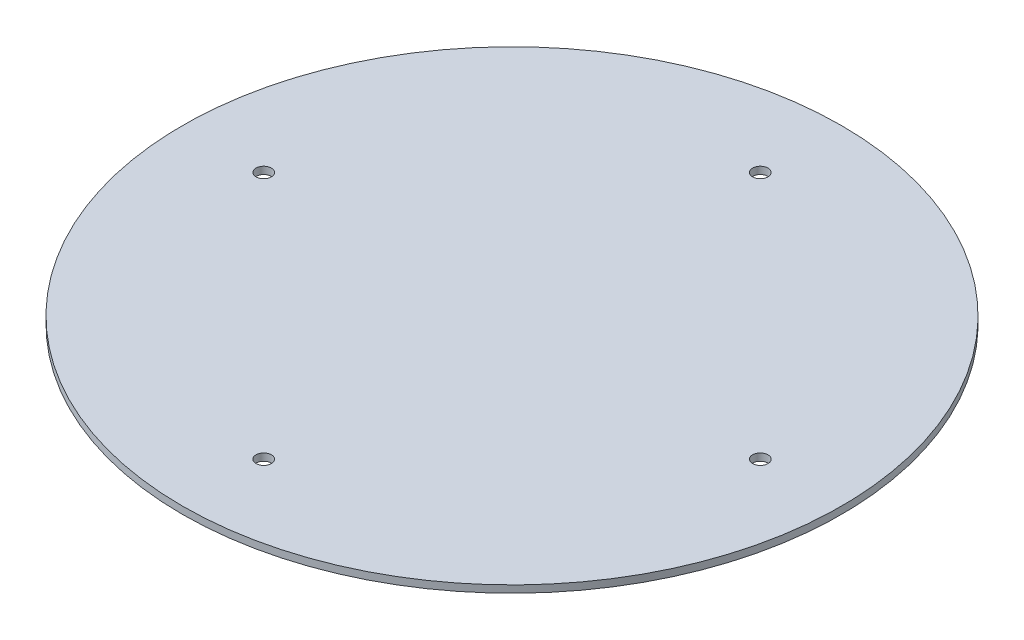
ISO-10303-21;
HEADER;
FILE_DESCRIPTION(('STEP AP214'),'2;1');
FILE_NAME('part.step','',(''),(''),'','','');
FILE_SCHEMA(('AUTOMOTIVE_DESIGN { 1 0 10303 214 1 1 1 1 }'));
ENDSEC;
DATA;
#1=APPLICATION_CONTEXT('core data for automotive mechanical design processes');
#2=APPLICATION_PROTOCOL_DEFINITION('international standard','automotive_design',2000,#1);
#3=PRODUCT_CONTEXT('',#1,'mechanical');
#4=PRODUCT('Part','Part','',(#3));
#5=PRODUCT_RELATED_PRODUCT_CATEGORY('part','',(#4));
#6=PRODUCT_DEFINITION_FORMATION('','',#4);
#7=PRODUCT_DEFINITION_CONTEXT('part definition',#1,'design');
#8=PRODUCT_DEFINITION('design','',#6,#7);
#9=PRODUCT_DEFINITION_SHAPE('','',#8);
#10=(LENGTH_UNIT() NAMED_UNIT(*) SI_UNIT(.MILLI.,.METRE.));
#11=(NAMED_UNIT(*) PLANE_ANGLE_UNIT() SI_UNIT($,.RADIAN.));
#12=(NAMED_UNIT(*) SI_UNIT($,.STERADIAN.) SOLID_ANGLE_UNIT());
#13=UNCERTAINTY_MEASURE_WITH_UNIT(LENGTH_MEASURE(1.E-05),#10,'distance_accuracy_value','');
#14=(GEOMETRIC_REPRESENTATION_CONTEXT(3) GLOBAL_UNCERTAINTY_ASSIGNED_CONTEXT((#13)) GLOBAL_UNIT_ASSIGNED_CONTEXT((#10,
#11,#12)) REPRESENTATION_CONTEXT('',''));
#15=CARTESIAN_POINT('',(0.,0.,0.));
#16=DIRECTION('',(0.,0.,1.));
#17=DIRECTION('',(1.,0.,0.));
#18=AXIS2_PLACEMENT_3D('',#15,#16,#17);
#19=CARTESIAN_POINT('',(0.,1.6,0.));
#20=DIRECTION('',(0.,-1.,0.));
#21=DIRECTION('',(0.,0.,-1.));
#22=AXIS2_PLACEMENT_3D('',#19,#20,#21);
#23=CYLINDRICAL_SURFACE('',#22,73.);
#24=CARTESIAN_POINT('',(0.,1.6,0.));
#25=DIRECTION('',(0.,1.,0.));
#26=DIRECTION('',(0.,0.,1.));
#27=AXIS2_PLACEMENT_3D('',#24,#25,#26);
#28=CIRCLE('',#27,73.);
#29=CARTESIAN_POINT('',(0.,1.6,73.));
#30=VERTEX_POINT('',#29);
#31=EDGE_CURVE('E11',#30,#30,#28,.T.);
#32=ORIENTED_EDGE('',*,*,#31,.F.);
#33=EDGE_LOOP('',(#32));
#34=FACE_BOUND('',#33,.T.);
#35=CARTESIAN_POINT('',(0.,0.,0.));
#36=DIRECTION('',(0.,1.,0.));
#37=DIRECTION('',(0.,0.,1.));
#38=AXIS2_PLACEMENT_3D('',#35,#36,#37);
#39=CIRCLE('',#38,73.);
#40=CARTESIAN_POINT('',(0.,0.,73.));
#41=VERTEX_POINT('',#40);
#42=EDGE_CURVE('E47',#41,#41,#39,.T.);
#43=ORIENTED_EDGE('',*,*,#42,.T.);
#44=EDGE_LOOP('',(#43));
#45=FACE_BOUND('',#44,.T.);
#46=ADVANCED_FACE('F44',(#34,#45),#23,.T.);
#47=CARTESIAN_POINT('',(0.,1.6,0.));
#48=DIRECTION('',(0.,1.,0.));
#49=DIRECTION('',(0.,0.,1.));
#50=AXIS2_PLACEMENT_3D('',#47,#48,#49);
#51=PLANE('',#50);
#52=CARTESIAN_POINT('',(0.,1.6,-55.));
#53=DIRECTION('',(0.,1.,0.));
#54=DIRECTION('',(0.,0.,1.));
#55=AXIS2_PLACEMENT_3D('',#52,#53,#54);
#56=CIRCLE('',#55,1.7);
#57=CARTESIAN_POINT('',(0.,1.6,-53.3));
#58=VERTEX_POINT('',#57);
#59=EDGE_CURVE('E85',#58,#58,#56,.T.);
#60=ORIENTED_EDGE('',*,*,#59,.F.);
#61=EDGE_LOOP('',(#60));
#62=FACE_BOUND('',#61,.T.);
#63=CARTESIAN_POINT('',(55.,1.6,0.));
#64=DIRECTION('',(0.,1.,0.));
#65=DIRECTION('',(0.,0.,1.));
#66=AXIS2_PLACEMENT_3D('',#63,#64,#65);
#67=CIRCLE('',#66,1.7);
#68=CARTESIAN_POINT('',(55.,1.6,1.69999999999998));
#69=VERTEX_POINT('',#68);
#70=EDGE_CURVE('E77',#69,#69,#67,.T.);
#71=ORIENTED_EDGE('',*,*,#70,.F.);
#72=EDGE_LOOP('',(#71));
#73=FACE_BOUND('',#72,.T.);
#74=CARTESIAN_POINT('',(-55.,1.6,0.));
#75=DIRECTION('',(0.,1.,0.));
#76=DIRECTION('',(0.,0.,1.));
#77=AXIS2_PLACEMENT_3D('',#74,#75,#76);
#78=CIRCLE('',#77,1.7);
#79=CARTESIAN_POINT('',(-55.,1.6,1.7));
#80=VERTEX_POINT('',#79);
#81=EDGE_CURVE('E70',#80,#80,#78,.T.);
#82=ORIENTED_EDGE('',*,*,#81,.F.);
#83=EDGE_LOOP('',(#82));
#84=FACE_BOUND('',#83,.T.);
#85=CARTESIAN_POINT('',(0.,1.6,55.));
#86=DIRECTION('',(0.,1.,0.));
#87=DIRECTION('',(0.,0.,1.));
#88=AXIS2_PLACEMENT_3D('',#85,#86,#87);
#89=CIRCLE('',#88,1.7);
#90=CARTESIAN_POINT('',(0.,1.6,56.7));
#91=VERTEX_POINT('',#90);
#92=EDGE_CURVE('E60',#91,#91,#89,.T.);
#93=ORIENTED_EDGE('',*,*,#92,.F.);
#94=EDGE_LOOP('',(#93));
#95=FACE_BOUND('',#94,.T.);
#96=ORIENTED_EDGE('',*,*,#31,.T.);
#97=EDGE_LOOP('',(#96));
#98=FACE_BOUND('',#97,.T.);
#99=ADVANCED_FACE('F93',(#62,#73,#84,#95,#98),#51,.T.);
#100=CARTESIAN_POINT('',(0.,0.,0.));
#101=DIRECTION('',(0.,1.,0.));
#102=DIRECTION('',(0.,0.,1.));
#103=AXIS2_PLACEMENT_3D('',#100,#101,#102);
#104=PLANE('',#103);
#105=CARTESIAN_POINT('',(0.,0.,-55.));
#106=DIRECTION('',(0.,1.,0.));
#107=DIRECTION('',(0.,0.,1.));
#108=AXIS2_PLACEMENT_3D('',#105,#106,#107);
#109=CIRCLE('',#108,1.7);
#110=CARTESIAN_POINT('',(0.,0.,-53.3));
#111=VERTEX_POINT('',#110);
#112=EDGE_CURVE('E82',#111,#111,#109,.T.);
#113=ORIENTED_EDGE('',*,*,#112,.T.);
#114=EDGE_LOOP('',(#113));
#115=FACE_BOUND('',#114,.T.);
#116=CARTESIAN_POINT('',(55.,0.,0.));
#117=DIRECTION('',(0.,1.,0.));
#118=DIRECTION('',(0.,0.,1.));
#119=AXIS2_PLACEMENT_3D('',#116,#117,#118);
#120=CIRCLE('',#119,1.7);
#121=CARTESIAN_POINT('',(55.,0.,1.69999999999998));
#122=VERTEX_POINT('',#121);
#123=EDGE_CURVE('E75',#122,#122,#120,.T.);
#124=ORIENTED_EDGE('',*,*,#123,.T.);
#125=EDGE_LOOP('',(#124));
#126=FACE_BOUND('',#125,.T.);
#127=CARTESIAN_POINT('',(-55.,0.,0.));
#128=DIRECTION('',(0.,1.,0.));
#129=DIRECTION('',(0.,0.,1.));
#130=AXIS2_PLACEMENT_3D('',#127,#128,#129);
#131=CIRCLE('',#130,1.7);
#132=CARTESIAN_POINT('',(-55.,0.,1.7));
#133=VERTEX_POINT('',#132);
#134=EDGE_CURVE('E64',#133,#133,#131,.T.);
#135=ORIENTED_EDGE('',*,*,#134,.T.);
#136=EDGE_LOOP('',(#135));
#137=FACE_BOUND('',#136,.T.);
#138=CARTESIAN_POINT('',(0.,0.,55.));
#139=DIRECTION('',(0.,1.,0.));
#140=DIRECTION('',(0.,0.,1.));
#141=AXIS2_PLACEMENT_3D('',#138,#139,#140);
#142=CIRCLE('',#141,1.7);
#143=CARTESIAN_POINT('',(0.,0.,56.7));
#144=VERTEX_POINT('',#143);
#145=EDGE_CURVE('E55',#144,#144,#142,.T.);
#146=ORIENTED_EDGE('',*,*,#145,.T.);
#147=EDGE_LOOP('',(#146));
#148=FACE_BOUND('',#147,.T.);
#149=ORIENTED_EDGE('',*,*,#42,.F.);
#150=EDGE_LOOP('',(#149));
#151=FACE_BOUND('',#150,.T.);
#152=ADVANCED_FACE('F96',(#115,#126,#137,#148,#151),#104,.F.);
#153=CARTESIAN_POINT('',(0.,1.6,55.));
#154=DIRECTION('',(0.,1.,0.));
#155=DIRECTION('',(0.,0.,1.));
#156=AXIS2_PLACEMENT_3D('',#153,#154,#155);
#157=CYLINDRICAL_SURFACE('',#156,1.7);
#158=ORIENTED_EDGE('',*,*,#145,.F.);
#159=EDGE_LOOP('',(#158));
#160=FACE_BOUND('',#159,.T.);
#161=ORIENTED_EDGE('',*,*,#92,.T.);
#162=EDGE_LOOP('',(#161));
#163=FACE_BOUND('',#162,.T.);
#164=ADVANCED_FACE('F104',(#160,#163),#157,.F.);
#165=CARTESIAN_POINT('',(-55.,1.6,0.));
#166=DIRECTION('',(0.,1.,0.));
#167=DIRECTION('',(0.,0.,1.));
#168=AXIS2_PLACEMENT_3D('',#165,#166,#167);
#169=CYLINDRICAL_SURFACE('',#168,1.7);
#170=ORIENTED_EDGE('',*,*,#134,.F.);
#171=EDGE_LOOP('',(#170));
#172=FACE_BOUND('',#171,.T.);
#173=ORIENTED_EDGE('',*,*,#81,.T.);
#174=EDGE_LOOP('',(#173));
#175=FACE_BOUND('',#174,.T.);
#176=ADVANCED_FACE('F106',(#172,#175),#169,.F.);
#177=CARTESIAN_POINT('',(55.,1.6,0.));
#178=DIRECTION('',(0.,1.,0.));
#179=DIRECTION('',(0.,0.,1.));
#180=AXIS2_PLACEMENT_3D('',#177,#178,#179);
#181=CYLINDRICAL_SURFACE('',#180,1.7);
#182=ORIENTED_EDGE('',*,*,#123,.F.);
#183=EDGE_LOOP('',(#182));
#184=FACE_BOUND('',#183,.T.);
#185=ORIENTED_EDGE('',*,*,#70,.T.);
#186=EDGE_LOOP('',(#185));
#187=FACE_BOUND('',#186,.T.);
#188=ADVANCED_FACE('F113',(#184,#187),#181,.F.);
#189=CARTESIAN_POINT('',(0.,1.6,-55.));
#190=DIRECTION('',(0.,1.,0.));
#191=DIRECTION('',(0.,0.,1.));
#192=AXIS2_PLACEMENT_3D('',#189,#190,#191);
#193=CYLINDRICAL_SURFACE('',#192,1.7);
#194=ORIENTED_EDGE('',*,*,#112,.F.);
#195=EDGE_LOOP('',(#194));
#196=FACE_BOUND('',#195,.T.);
#197=ORIENTED_EDGE('',*,*,#59,.T.);
#198=EDGE_LOOP('',(#197));
#199=FACE_BOUND('',#198,.T.);
#200=ADVANCED_FACE('F91',(#196,#199),#193,.F.);
#201=CLOSED_SHELL('',(#46,#99,#152,#164,#176,#188,#200));
#202=MANIFOLD_SOLID_BREP('B2',#201);
#203=ADVANCED_BREP_SHAPE_REPRESENTATION('',(#18,#202),#14);
#204=SHAPE_DEFINITION_REPRESENTATION(#9,#203);
ENDSEC;
END-ISO-10303-21;
